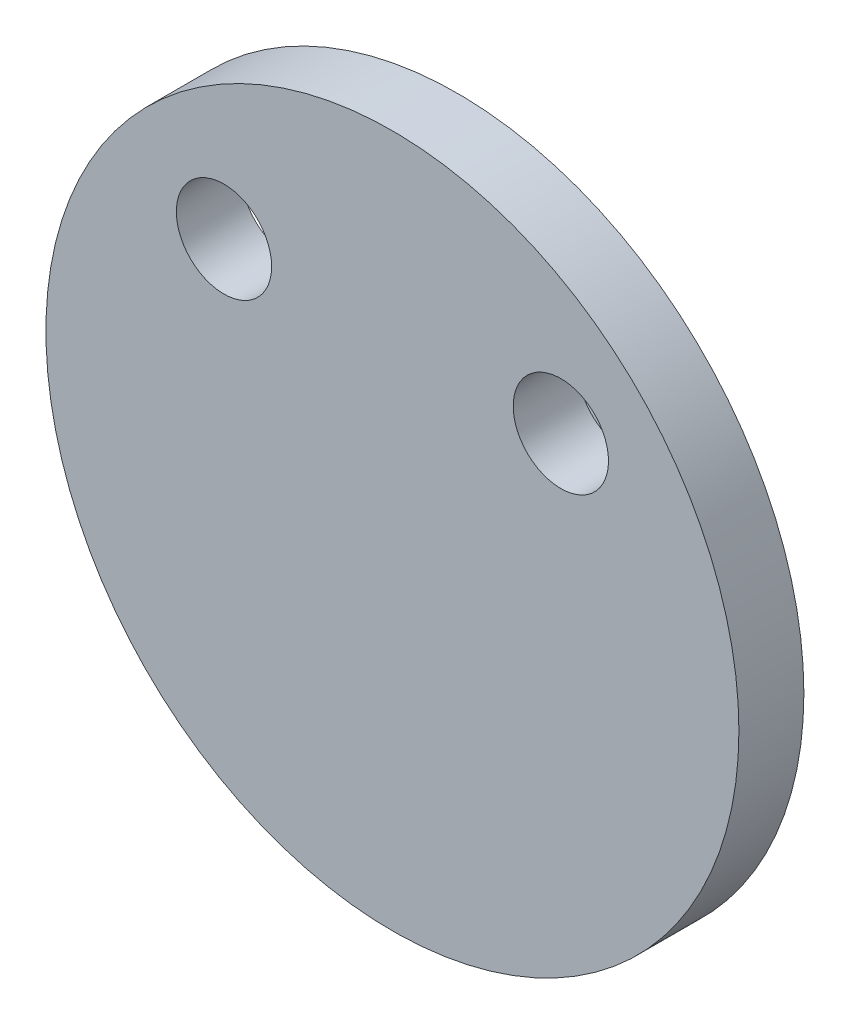
ISO-10303-21;
HEADER;
FILE_DESCRIPTION(('STEP AP214'),'2;1');
FILE_NAME('part.step','',(''),(''),'','','');
FILE_SCHEMA(('AUTOMOTIVE_DESIGN { 1 0 10303 214 1 1 1 1 }'));
ENDSEC;
DATA;
#1=APPLICATION_CONTEXT('core data for automotive mechanical design processes');
#2=APPLICATION_PROTOCOL_DEFINITION('international standard','automotive_design',2000,#1);
#3=PRODUCT_CONTEXT('',#1,'mechanical');
#4=PRODUCT('Part','Part','',(#3));
#5=PRODUCT_RELATED_PRODUCT_CATEGORY('part','',(#4));
#6=PRODUCT_DEFINITION_FORMATION('','',#4);
#7=PRODUCT_DEFINITION_CONTEXT('part definition',#1,'design');
#8=PRODUCT_DEFINITION('design','',#6,#7);
#9=PRODUCT_DEFINITION_SHAPE('','',#8);
#10=(LENGTH_UNIT() NAMED_UNIT(*) SI_UNIT(.MILLI.,.METRE.));
#11=(NAMED_UNIT(*) PLANE_ANGLE_UNIT() SI_UNIT($,.RADIAN.));
#12=(NAMED_UNIT(*) SI_UNIT($,.STERADIAN.) SOLID_ANGLE_UNIT());
#13=UNCERTAINTY_MEASURE_WITH_UNIT(LENGTH_MEASURE(1.E-05),#10,'distance_accuracy_value','');
#14=(GEOMETRIC_REPRESENTATION_CONTEXT(3) GLOBAL_UNCERTAINTY_ASSIGNED_CONTEXT((#13)) GLOBAL_UNIT_ASSIGNED_CONTEXT((#10,
#11,#12)) REPRESENTATION_CONTEXT('',''));
#15=CARTESIAN_POINT('',(0.,0.,0.));
#16=DIRECTION('',(0.,0.,1.));
#17=DIRECTION('',(1.,0.,0.));
#18=AXIS2_PLACEMENT_3D('',#15,#16,#17);
#19=CARTESIAN_POINT('',(0.,0.,1.5));
#20=DIRECTION('',(0.,0.,1.));
#21=DIRECTION('',(1.,0.,0.));
#22=AXIS2_PLACEMENT_3D('',#19,#20,#21);
#23=PLANE('',#22);
#24=CARTESIAN_POINT('',(3.88908729652601,3.88908729652601,1.5));
#25=DIRECTION('',(0.,0.,1.));
#26=DIRECTION('',(1.,0.,0.));
#27=AXIS2_PLACEMENT_3D('',#24,#25,#26);
#28=CIRCLE('',#27,1.1);
#29=CARTESIAN_POINT('',(4.98908729652601,3.88908729652601,1.5));
#30=VERTEX_POINT('',#29);
#31=EDGE_CURVE('E53',#30,#30,#28,.T.);
#32=ORIENTED_EDGE('',*,*,#31,.F.);
#33=EDGE_LOOP('',(#32));
#34=FACE_BOUND('',#33,.T.);
#35=CARTESIAN_POINT('',(0.,0.,1.5));
#36=DIRECTION('',(0.,0.,1.));
#37=DIRECTION('',(1.,0.,0.));
#38=AXIS2_PLACEMENT_3D('',#35,#36,#37);
#39=CIRCLE('',#38,8.);
#40=CARTESIAN_POINT('',(8.,0.,1.5));
#41=VERTEX_POINT('',#40);
#42=EDGE_CURVE('E44',#41,#41,#39,.T.);
#43=ORIENTED_EDGE('',*,*,#42,.T.);
#44=EDGE_LOOP('',(#43));
#45=FACE_BOUND('',#44,.T.);
#46=CARTESIAN_POINT('',(-3.88908729652601,3.88908729652601,1.5));
#47=DIRECTION('',(0.,0.,1.));
#48=DIRECTION('',(1.,0.,0.));
#49=AXIS2_PLACEMENT_3D('',#46,#47,#48);
#50=CIRCLE('',#49,1.1);
#51=CARTESIAN_POINT('',(-2.78908729652601,3.88908729652601,1.5));
#52=VERTEX_POINT('',#51);
#53=EDGE_CURVE('E58',#52,#52,#50,.T.);
#54=ORIENTED_EDGE('',*,*,#53,.F.);
#55=EDGE_LOOP('',(#54));
#56=FACE_BOUND('',#55,.T.);
#57=ADVANCED_FACE('F37',(#34,#45,#56),#23,.T.);
#58=CARTESIAN_POINT('',(0.,0.,0.));
#59=DIRECTION('',(0.,0.,1.));
#60=DIRECTION('',(1.,0.,0.));
#61=AXIS2_PLACEMENT_3D('',#58,#59,#60);
#62=PLANE('',#61);
#63=CARTESIAN_POINT('',(0.,0.,0.));
#64=DIRECTION('',(0.,0.,1.));
#65=DIRECTION('',(1.,0.,0.));
#66=AXIS2_PLACEMENT_3D('',#63,#64,#65);
#67=CIRCLE('',#66,3.5);
#68=CARTESIAN_POINT('',(3.5,0.,0.));
#69=VERTEX_POINT('',#68);
#70=EDGE_CURVE('E67',#69,#69,#67,.T.);
#71=ORIENTED_EDGE('',*,*,#70,.T.);
#72=EDGE_LOOP('',(#71));
#73=FACE_BOUND('',#72,.T.);
#74=CARTESIAN_POINT('',(0.,0.,0.));
#75=DIRECTION('',(0.,0.,1.));
#76=DIRECTION('',(1.,0.,0.));
#77=AXIS2_PLACEMENT_3D('',#74,#75,#76);
#78=CIRCLE('',#77,8.);
#79=CARTESIAN_POINT('',(8.,0.,0.));
#80=VERTEX_POINT('',#79);
#81=EDGE_CURVE('E48',#80,#80,#78,.T.);
#82=ORIENTED_EDGE('',*,*,#81,.F.);
#83=EDGE_LOOP('',(#82));
#84=FACE_BOUND('',#83,.T.);
#85=CARTESIAN_POINT('',(3.88908729652601,3.88908729652601,0.));
#86=DIRECTION('',(0.,0.,1.));
#87=DIRECTION('',(1.,0.,0.));
#88=AXIS2_PLACEMENT_3D('',#85,#86,#87);
#89=CIRCLE('',#88,1.1);
#90=CARTESIAN_POINT('',(4.98908729652601,3.88908729652601,0.));
#91=VERTEX_POINT('',#90);
#92=EDGE_CURVE('E55',#91,#91,#89,.T.);
#93=ORIENTED_EDGE('',*,*,#92,.T.);
#94=EDGE_LOOP('',(#93));
#95=FACE_BOUND('',#94,.T.);
#96=CARTESIAN_POINT('',(-3.88908729652601,3.88908729652601,0.));
#97=DIRECTION('',(0.,0.,1.));
#98=DIRECTION('',(1.,0.,0.));
#99=AXIS2_PLACEMENT_3D('',#96,#97,#98);
#100=CIRCLE('',#99,1.1);
#101=CARTESIAN_POINT('',(-2.78908729652601,3.88908729652601,0.));
#102=VERTEX_POINT('',#101);
#103=EDGE_CURVE('E61',#102,#102,#100,.T.);
#104=ORIENTED_EDGE('',*,*,#103,.T.);
#105=EDGE_LOOP('',(#104));
#106=FACE_BOUND('',#105,.T.);
#107=ADVANCED_FACE('F88',(#73,#84,#95,#106),#62,.F.);
#108=CARTESIAN_POINT('',(0.,0.,1.5));
#109=DIRECTION('',(0.,0.,-1.));
#110=DIRECTION('',(-1.,0.,0.));
#111=AXIS2_PLACEMENT_3D('',#108,#109,#110);
#112=CYLINDRICAL_SURFACE('',#111,8.);
#113=ORIENTED_EDGE('',*,*,#42,.F.);
#114=EDGE_LOOP('',(#113));
#115=FACE_BOUND('',#114,.T.);
#116=ORIENTED_EDGE('',*,*,#81,.T.);
#117=EDGE_LOOP('',(#116));
#118=FACE_BOUND('',#117,.T.);
#119=ADVANCED_FACE('F39',(#115,#118),#112,.T.);
#120=CARTESIAN_POINT('',(3.88908729652601,3.88908729652601,1.5));
#121=DIRECTION('',(0.,0.,-1.));
#122=DIRECTION('',(-1.,0.,0.));
#123=AXIS2_PLACEMENT_3D('',#120,#121,#122);
#124=CYLINDRICAL_SURFACE('',#123,1.1);
#125=ORIENTED_EDGE('',*,*,#31,.T.);
#126=EDGE_LOOP('',(#125));
#127=FACE_BOUND('',#126,.T.);
#128=ORIENTED_EDGE('',*,*,#92,.F.);
#129=EDGE_LOOP('',(#128));
#130=FACE_BOUND('',#129,.T.);
#131=ADVANCED_FACE('F101',(#127,#130),#124,.F.);
#132=CARTESIAN_POINT('',(-3.88908729652601,3.88908729652601,1.5));
#133=DIRECTION('',(0.,0.,-1.));
#134=DIRECTION('',(-1.,0.,0.));
#135=AXIS2_PLACEMENT_3D('',#132,#133,#134);
#136=CYLINDRICAL_SURFACE('',#135,1.1);
#137=ORIENTED_EDGE('',*,*,#53,.T.);
#138=EDGE_LOOP('',(#137));
#139=FACE_BOUND('',#138,.T.);
#140=ORIENTED_EDGE('',*,*,#103,.F.);
#141=EDGE_LOOP('',(#140));
#142=FACE_BOUND('',#141,.T.);
#143=ADVANCED_FACE('F104',(#139,#142),#136,.F.);
#144=CARTESIAN_POINT('',(0.,0.,-3.));
#145=DIRECTION('',(0.,0.,1.));
#146=DIRECTION('',(1.,0.,0.));
#147=AXIS2_PLACEMENT_3D('',#144,#145,#146);
#148=CYLINDRICAL_SURFACE('',#147,3.5);
#149=CARTESIAN_POINT('',(0.,0.,-3.));
#150=DIRECTION('',(0.,0.,1.));
#151=DIRECTION('',(1.,0.,0.));
#152=AXIS2_PLACEMENT_3D('',#149,#150,#151);
#153=CIRCLE('',#152,3.5);
#154=CARTESIAN_POINT('',(3.5,0.,-3.));
#155=VERTEX_POINT('',#154);
#156=EDGE_CURVE('E64',#155,#155,#153,.T.);
#157=ORIENTED_EDGE('',*,*,#156,.T.);
#158=EDGE_LOOP('',(#157));
#159=FACE_BOUND('',#158,.T.);
#160=ORIENTED_EDGE('',*,*,#70,.F.);
#161=EDGE_LOOP('',(#160));
#162=FACE_BOUND('',#161,.T.);
#163=ADVANCED_FACE('F89',(#159,#162),#148,.T.);
#164=CARTESIAN_POINT('',(0.,0.,-3.));
#165=DIRECTION('',(0.,0.,1.));
#166=DIRECTION('',(1.,0.,0.));
#167=AXIS2_PLACEMENT_3D('',#164,#165,#166);
#168=PLANE('',#167);
#169=CARTESIAN_POINT('',(0.,0.,-3.));
#170=DIRECTION('',(0.,0.,1.));
#171=DIRECTION('',(1.,0.,0.));
#172=AXIS2_PLACEMENT_3D('',#169,#170,#171);
#173=CIRCLE('',#172,2.35);
#174=CARTESIAN_POINT('',(2.35,0.,-3.));
#175=VERTEX_POINT('',#174);
#176=EDGE_CURVE('E70',#175,#175,#173,.T.);
#177=ORIENTED_EDGE('',*,*,#176,.T.);
#178=EDGE_LOOP('',(#177));
#179=FACE_BOUND('',#178,.T.);
#180=ORIENTED_EDGE('',*,*,#156,.F.);
#181=EDGE_LOOP('',(#180));
#182=FACE_BOUND('',#181,.T.);
#183=ADVANCED_FACE('F76',(#179,#182),#168,.F.);
#184=CARTESIAN_POINT('',(0.,0.,-3.));
#185=DIRECTION('',(0.,0.,1.));
#186=DIRECTION('',(1.,0.,0.));
#187=AXIS2_PLACEMENT_3D('',#184,#185,#186);
#188=CYLINDRICAL_SURFACE('',#187,2.35);
#189=ORIENTED_EDGE('',*,*,#176,.F.);
#190=EDGE_LOOP('',(#189));
#191=FACE_BOUND('',#190,.T.);
#192=CARTESIAN_POINT('',(0.,0.,0.));
#193=DIRECTION('',(0.,0.,1.));
#194=DIRECTION('',(1.,0.,0.));
#195=AXIS2_PLACEMENT_3D('',#192,#193,#194);
#196=CIRCLE('',#195,2.35);
#197=CARTESIAN_POINT('',(2.35,0.,0.));
#198=VERTEX_POINT('',#197);
#199=EDGE_CURVE('E10',#198,#198,#196,.T.);
#200=ORIENTED_EDGE('',*,*,#199,.T.);
#201=EDGE_LOOP('',(#200));
#202=FACE_BOUND('',#201,.T.);
#203=ADVANCED_FACE('F79',(#191,#202),#188,.F.);
#204=ORIENTED_EDGE('',*,*,#199,.F.);
#205=EDGE_LOOP('',(#204));
#206=FACE_BOUND('',#205,.T.);
#207=ADVANCED_FACE('F81',(#206),#62,.F.);
#208=CLOSED_SHELL('',(#57,#107,#119,#131,#143,#163,#183,#203,#207));
#209=MANIFOLD_SOLID_BREP('B2',#208);
#210=ADVANCED_BREP_SHAPE_REPRESENTATION('',(#18,#209),#14);
#211=SHAPE_DEFINITION_REPRESENTATION(#9,#210);
ENDSEC;
END-ISO-10303-21;
